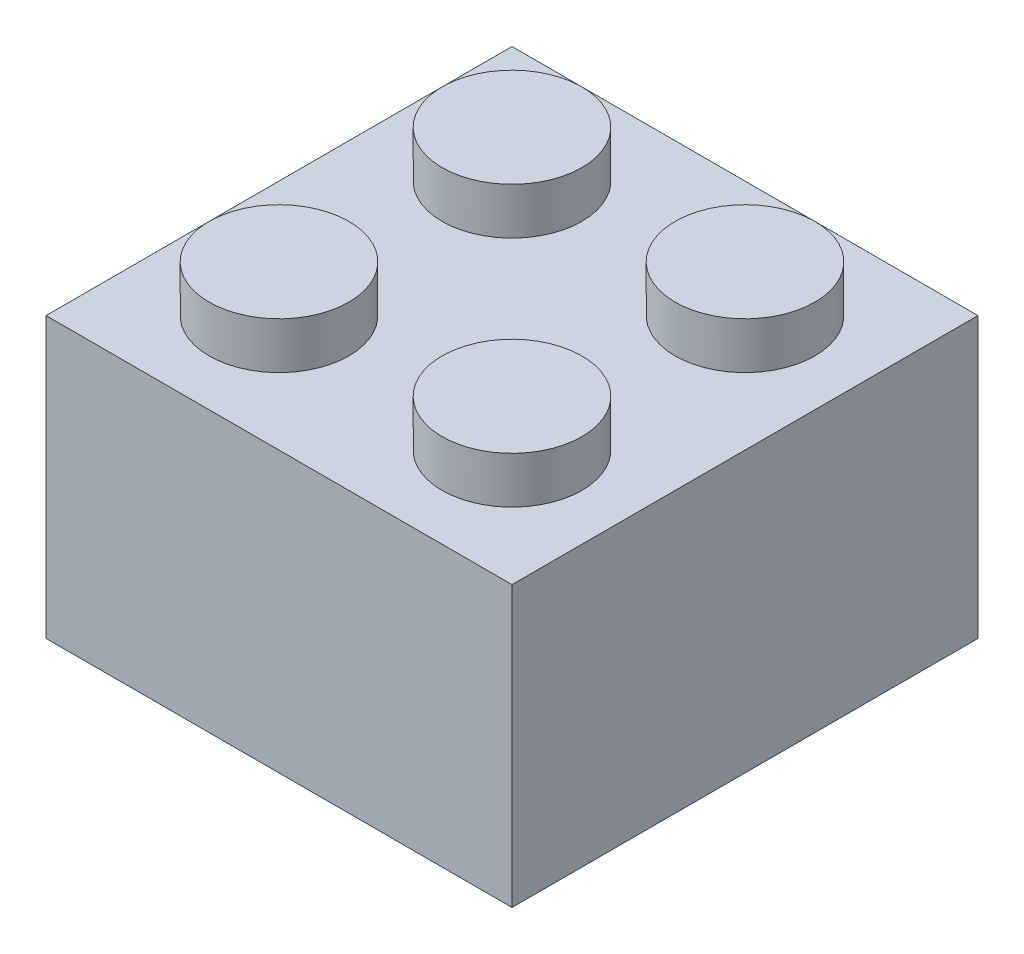
ISO-10303-21;
HEADER;
FILE_DESCRIPTION(('STEP AP214'),'2;1');
FILE_NAME('part.step','',(''),(''),'','','');
FILE_SCHEMA(('AUTOMOTIVE_DESIGN { 1 0 10303 214 1 1 1 1 }'));
ENDSEC;
DATA;
#1=APPLICATION_CONTEXT('core data for automotive mechanical design processes');
#2=APPLICATION_PROTOCOL_DEFINITION('international standard','automotive_design',2000,#1);
#3=PRODUCT_CONTEXT('',#1,'mechanical');
#4=PRODUCT('Part','Part','',(#3));
#5=PRODUCT_RELATED_PRODUCT_CATEGORY('part','',(#4));
#6=PRODUCT_DEFINITION_FORMATION('','',#4);
#7=PRODUCT_DEFINITION_CONTEXT('part definition',#1,'design');
#8=PRODUCT_DEFINITION('design','',#6,#7);
#9=PRODUCT_DEFINITION_SHAPE('','',#8);
#10=(LENGTH_UNIT() NAMED_UNIT(*) SI_UNIT(.MILLI.,.METRE.));
#11=(NAMED_UNIT(*) PLANE_ANGLE_UNIT() SI_UNIT($,.RADIAN.));
#12=(NAMED_UNIT(*) SI_UNIT($,.STERADIAN.) SOLID_ANGLE_UNIT());
#13=UNCERTAINTY_MEASURE_WITH_UNIT(LENGTH_MEASURE(1.E-05),#10,'distance_accuracy_value','');
#14=(GEOMETRIC_REPRESENTATION_CONTEXT(3) GLOBAL_UNCERTAINTY_ASSIGNED_CONTEXT((#13)) GLOBAL_UNIT_ASSIGNED_CONTEXT((#10,
#11,#12)) REPRESENTATION_CONTEXT('',''));
#15=CARTESIAN_POINT('',(0.,0.,0.));
#16=DIRECTION('',(0.,0.,1.));
#17=DIRECTION('',(1.,0.,0.));
#18=AXIS2_PLACEMENT_3D('',#15,#16,#17);
#19=CARTESIAN_POINT('',(12.,4.8,4.));
#20=DIRECTION('',(-1.,0.,0.));
#21=DIRECTION('',(0.,0.,1.));
#22=AXIS2_PLACEMENT_3D('',#19,#20,#21);
#23=PLANE('',#22);
#24=DIRECTION('',(0.,0.,-1.));
#25=VECTOR('',#24,1.);
#26=CARTESIAN_POINT('',(12.,0.,4.));
#27=LINE('',#26,#25);
#28=CARTESIAN_POINT('',(12.,0.,12.));
#29=VERTEX_POINT('',#28);
#30=CARTESIAN_POINT('',(12.,0.,-4.));
#31=VERTEX_POINT('',#30);
#32=EDGE_CURVE('E120',#29,#31,#27,.T.);
#33=ORIENTED_EDGE('',*,*,#32,.T.);
#34=DIRECTION('',(0.,-1.,0.));
#35=VECTOR('',#34,1.);
#36=CARTESIAN_POINT('',(12.,4.8,-4.));
#37=LINE('',#36,#35);
#38=CARTESIAN_POINT('',(12.,9.6,-4.));
#39=VERTEX_POINT('',#38);
#40=EDGE_CURVE('E21',#39,#31,#37,.T.);
#41=ORIENTED_EDGE('',*,*,#40,.F.);
#42=DIRECTION('',(0.,0.,-1.));
#43=VECTOR('',#42,1.);
#44=CARTESIAN_POINT('',(12.,9.6,4.));
#45=LINE('',#44,#43);
#46=CARTESIAN_POINT('',(12.,9.6,12.));
#47=VERTEX_POINT('',#46);
#48=EDGE_CURVE('E11',#47,#39,#45,.T.);
#49=ORIENTED_EDGE('',*,*,#48,.F.);
#50=DIRECTION('',(0.,1.,0.));
#51=VECTOR('',#50,1.);
#52=CARTESIAN_POINT('',(12.,4.8,12.));
#53=LINE('',#52,#51);
#54=EDGE_CURVE('E122',#29,#47,#53,.T.);
#55=ORIENTED_EDGE('',*,*,#54,.F.);
#56=EDGE_LOOP('',(#33,#41,#49,#55));
#57=FACE_BOUND('',#56,.T.);
#58=ADVANCED_FACE('F17',(#57),#23,.F.);
#59=CARTESIAN_POINT('',(4.,9.6,4.));
#60=DIRECTION('',(0.,-1.,0.));
#61=DIRECTION('',(0.,0.,-1.));
#62=AXIS2_PLACEMENT_3D('',#59,#60,#61);
#63=PLANE('',#62);
#64=ORIENTED_EDGE('',*,*,#48,.T.);
#65=DIRECTION('',(1.,0.,0.));
#66=VECTOR('',#65,1.);
#67=CARTESIAN_POINT('',(4.,9.6,-4.));
#68=LINE('',#67,#66);
#69=CARTESIAN_POINT('',(-4.,9.6,-4.));
#70=VERTEX_POINT('',#69);
#71=EDGE_CURVE('E129',#70,#39,#68,.T.);
#72=ORIENTED_EDGE('',*,*,#71,.F.);
#73=DIRECTION('',(0.,0.,-1.));
#74=VECTOR('',#73,1.);
#75=CARTESIAN_POINT('',(-4.,9.6,4.));
#76=LINE('',#75,#74);
#77=CARTESIAN_POINT('',(-4.,9.6,12.));
#78=VERTEX_POINT('',#77);
#79=EDGE_CURVE('E27',#78,#70,#76,.T.);
#80=ORIENTED_EDGE('',*,*,#79,.F.);
#81=DIRECTION('',(-1.,0.,0.));
#82=VECTOR('',#81,1.);
#83=CARTESIAN_POINT('',(4.,9.6,12.));
#84=LINE('',#83,#82);
#85=EDGE_CURVE('E145',#47,#78,#84,.T.);
#86=ORIENTED_EDGE('',*,*,#85,.F.);
#87=EDGE_LOOP('',(#64,#72,#80,#86));
#88=FACE_BOUND('',#87,.T.);
#89=CARTESIAN_POINT('',(0.,9.6,0.));
#90=DIRECTION('',(0.,-1.,0.));
#91=DIRECTION('',(1.,0.,0.));
#92=AXIS2_PLACEMENT_3D('',#89,#90,#91);
#93=CIRCLE('',#92,2.4);
#94=CARTESIAN_POINT('',(-2.4,9.6,0.));
#95=VERTEX_POINT('',#94);
#96=EDGE_CURVE('E103',#95,#95,#93,.T.);
#97=ORIENTED_EDGE('',*,*,#96,.T.);
#98=EDGE_LOOP('',(#97));
#99=FACE_BOUND('',#98,.T.);
#100=CARTESIAN_POINT('',(0.,9.6,8.));
#101=DIRECTION('',(0.,-1.,0.));
#102=DIRECTION('',(1.,0.,0.));
#103=AXIS2_PLACEMENT_3D('',#100,#101,#102);
#104=CIRCLE('',#103,2.4);
#105=CARTESIAN_POINT('',(-2.4,9.6,8.));
#106=VERTEX_POINT('',#105);
#107=EDGE_CURVE('E104',#106,#106,#104,.T.);
#108=ORIENTED_EDGE('',*,*,#107,.T.);
#109=EDGE_LOOP('',(#108));
#110=FACE_BOUND('',#109,.T.);
#111=CARTESIAN_POINT('',(8.,9.6,0.));
#112=DIRECTION('',(0.,-1.,0.));
#113=DIRECTION('',(1.,0.,0.));
#114=AXIS2_PLACEMENT_3D('',#111,#112,#113);
#115=CIRCLE('',#114,2.4);
#116=CARTESIAN_POINT('',(5.6,9.6,0.));
#117=VERTEX_POINT('',#116);
#118=EDGE_CURVE('E107',#117,#117,#115,.T.);
#119=ORIENTED_EDGE('',*,*,#118,.T.);
#120=EDGE_LOOP('',(#119));
#121=FACE_BOUND('',#120,.T.);
#122=CARTESIAN_POINT('',(8.,9.6,8.));
#123=DIRECTION('',(0.,-1.,0.));
#124=DIRECTION('',(1.,0.,0.));
#125=AXIS2_PLACEMENT_3D('',#122,#123,#124);
#126=CIRCLE('',#125,2.4);
#127=CARTESIAN_POINT('',(5.6,9.6,8.));
#128=VERTEX_POINT('',#127);
#129=EDGE_CURVE('E108',#128,#128,#126,.T.);
#130=ORIENTED_EDGE('',*,*,#129,.T.);
#131=EDGE_LOOP('',(#130));
#132=FACE_BOUND('',#131,.T.);
#133=ADVANCED_FACE('F206',(#88,#99,#110,#121,#132),#63,.F.);
#134=CARTESIAN_POINT('',(-4.,4.8,4.));
#135=DIRECTION('',(1.,0.,0.));
#136=DIRECTION('',(0.,0.,-1.));
#137=AXIS2_PLACEMENT_3D('',#134,#135,#136);
#138=PLANE('',#137);
#139=ORIENTED_EDGE('',*,*,#79,.T.);
#140=DIRECTION('',(0.,1.,0.));
#141=VECTOR('',#140,1.);
#142=CARTESIAN_POINT('',(-4.,4.8,-4.));
#143=LINE('',#142,#141);
#144=CARTESIAN_POINT('',(-4.,0.,-4.));
#145=VERTEX_POINT('',#144);
#146=EDGE_CURVE('E97',#145,#70,#143,.T.);
#147=ORIENTED_EDGE('',*,*,#146,.F.);
#148=DIRECTION('',(0.,0.,-1.));
#149=VECTOR('',#148,1.);
#150=CARTESIAN_POINT('',(-4.,0.,4.));
#151=LINE('',#150,#149);
#152=CARTESIAN_POINT('',(-4.,0.,12.));
#153=VERTEX_POINT('',#152);
#154=EDGE_CURVE('E127',#153,#145,#151,.T.);
#155=ORIENTED_EDGE('',*,*,#154,.F.);
#156=DIRECTION('',(0.,-1.,0.));
#157=VECTOR('',#156,1.);
#158=CARTESIAN_POINT('',(-4.,4.8,12.));
#159=LINE('',#158,#157);
#160=EDGE_CURVE('E112',#78,#153,#159,.T.);
#161=ORIENTED_EDGE('',*,*,#160,.F.);
#162=EDGE_LOOP('',(#139,#147,#155,#161));
#163=FACE_BOUND('',#162,.T.);
#164=ADVANCED_FACE('F161',(#163),#138,.F.);
#165=CARTESIAN_POINT('',(4.,0.,4.));
#166=DIRECTION('',(0.,1.,0.));
#167=DIRECTION('',(0.,0.,1.));
#168=AXIS2_PLACEMENT_3D('',#165,#166,#167);
#169=PLANE('',#168);
#170=ORIENTED_EDGE('',*,*,#154,.T.);
#171=DIRECTION('',(-1.,0.,0.));
#172=VECTOR('',#171,1.);
#173=CARTESIAN_POINT('',(4.,0.,-4.));
#174=LINE('',#173,#172);
#175=EDGE_CURVE('E116',#31,#145,#174,.T.);
#176=ORIENTED_EDGE('',*,*,#175,.F.);
#177=ORIENTED_EDGE('',*,*,#32,.F.);
#178=DIRECTION('',(1.,0.,0.));
#179=VECTOR('',#178,1.);
#180=CARTESIAN_POINT('',(4.,0.,12.));
#181=LINE('',#180,#179);
#182=EDGE_CURVE('E109',#153,#29,#181,.T.);
#183=ORIENTED_EDGE('',*,*,#182,.F.);
#184=EDGE_LOOP('',(#170,#176,#177,#183));
#185=FACE_BOUND('',#184,.T.);
#186=CARTESIAN_POINT('',(0.,0.,0.));
#187=DIRECTION('',(0.,1.,0.));
#188=DIRECTION('',(1.,0.,0.));
#189=AXIS2_PLACEMENT_3D('',#186,#187,#188);
#190=CIRCLE('',#189,2.4);
#191=CARTESIAN_POINT('',(-2.4,0.,0.));
#192=VERTEX_POINT('',#191);
#193=EDGE_CURVE('E123',#192,#192,#190,.T.);
#194=ORIENTED_EDGE('',*,*,#193,.T.);
#195=EDGE_LOOP('',(#194));
#196=FACE_BOUND('',#195,.T.);
#197=CARTESIAN_POINT('',(0.,0.,8.));
#198=DIRECTION('',(0.,1.,0.));
#199=DIRECTION('',(1.,0.,0.));
#200=AXIS2_PLACEMENT_3D('',#197,#198,#199);
#201=CIRCLE('',#200,2.4);
#202=CARTESIAN_POINT('',(-2.4,0.,8.));
#203=VERTEX_POINT('',#202);
#204=EDGE_CURVE('E93',#203,#203,#201,.T.);
#205=ORIENTED_EDGE('',*,*,#204,.T.);
#206=EDGE_LOOP('',(#205));
#207=FACE_BOUND('',#206,.T.);
#208=CARTESIAN_POINT('',(8.,0.,0.));
#209=DIRECTION('',(0.,1.,0.));
#210=DIRECTION('',(1.,0.,0.));
#211=AXIS2_PLACEMENT_3D('',#208,#209,#210);
#212=CIRCLE('',#211,2.4);
#213=CARTESIAN_POINT('',(5.6,0.,0.));
#214=VERTEX_POINT('',#213);
#215=EDGE_CURVE('E87',#214,#214,#212,.T.);
#216=ORIENTED_EDGE('',*,*,#215,.T.);
#217=EDGE_LOOP('',(#216));
#218=FACE_BOUND('',#217,.T.);
#219=CARTESIAN_POINT('',(8.,0.,8.));
#220=DIRECTION('',(0.,1.,0.));
#221=DIRECTION('',(1.,0.,0.));
#222=AXIS2_PLACEMENT_3D('',#219,#220,#221);
#223=CIRCLE('',#222,2.4);
#224=CARTESIAN_POINT('',(5.6,0.,8.));
#225=VERTEX_POINT('',#224);
#226=EDGE_CURVE('E94',#225,#225,#223,.T.);
#227=ORIENTED_EDGE('',*,*,#226,.T.);
#228=EDGE_LOOP('',(#227));
#229=FACE_BOUND('',#228,.T.);
#230=CARTESIAN_POINT('',(4.,0.,4.));
#231=DIRECTION('',(0.,1.,0.));
#232=DIRECTION('',(1.,0.,0.));
#233=AXIS2_PLACEMENT_3D('',#230,#231,#232);
#234=CIRCLE('',#233,2.4);
#235=CARTESIAN_POINT('',(1.6,0.,4.));
#236=VERTEX_POINT('',#235);
#237=EDGE_CURVE('E137',#236,#236,#234,.T.);
#238=ORIENTED_EDGE('',*,*,#237,.T.);
#239=EDGE_LOOP('',(#238));
#240=FACE_BOUND('',#239,.T.);
#241=ADVANCED_FACE('F88',(#185,#196,#207,#218,#229,#240),#169,.F.);
#242=CARTESIAN_POINT('',(4.,4.8,-4.));
#243=DIRECTION('',(0.,0.,1.));
#244=DIRECTION('',(1.,0.,0.));
#245=AXIS2_PLACEMENT_3D('',#242,#243,#244);
#246=PLANE('',#245);
#247=ORIENTED_EDGE('',*,*,#40,.T.);
#248=ORIENTED_EDGE('',*,*,#175,.T.);
#249=ORIENTED_EDGE('',*,*,#146,.T.);
#250=ORIENTED_EDGE('',*,*,#71,.T.);
#251=EDGE_LOOP('',(#247,#248,#249,#250));
#252=FACE_BOUND('',#251,.T.);
#253=ADVANCED_FACE('F239',(#252),#246,.F.);
#254=CARTESIAN_POINT('',(4.,4.8,12.));
#255=DIRECTION('',(0.,0.,1.));
#256=DIRECTION('',(1.,0.,0.));
#257=AXIS2_PLACEMENT_3D('',#254,#255,#256);
#258=PLANE('',#257);
#259=ORIENTED_EDGE('',*,*,#54,.T.);
#260=ORIENTED_EDGE('',*,*,#85,.T.);
#261=ORIENTED_EDGE('',*,*,#160,.T.);
#262=ORIENTED_EDGE('',*,*,#182,.T.);
#263=EDGE_LOOP('',(#259,#260,#261,#262));
#264=FACE_BOUND('',#263,.T.);
#265=ADVANCED_FACE('F19',(#264),#258,.T.);
#266=CARTESIAN_POINT('',(0.,11.2,0.));
#267=DIRECTION('',(0.,1.,0.));
#268=DIRECTION('',(1.,0.,0.));
#269=AXIS2_PLACEMENT_3D('',#266,#267,#268);
#270=PLANE('',#269);
#271=CARTESIAN_POINT('',(0.,11.2,0.));
#272=DIRECTION('',(0.,1.,0.));
#273=DIRECTION('',(1.,0.,0.));
#274=AXIS2_PLACEMENT_3D('',#271,#272,#273);
#275=CIRCLE('',#274,2.4);
#276=CARTESIAN_POINT('',(2.4,11.2,0.));
#277=VERTEX_POINT('',#276);
#278=EDGE_CURVE('E100',#277,#277,#275,.T.);
#279=ORIENTED_EDGE('',*,*,#278,.T.);
#280=EDGE_LOOP('',(#279));
#281=FACE_BOUND('',#280,.T.);
#282=ADVANCED_FACE('F246',(#281),#270,.T.);
#283=CARTESIAN_POINT('',(0.,10.15,0.));
#284=DIRECTION('',(0.,-1.,0.));
#285=DIRECTION('',(1.,0.,0.));
#286=AXIS2_PLACEMENT_3D('',#283,#284,#285);
#287=CYLINDRICAL_SURFACE('',#286,2.4);
#288=ORIENTED_EDGE('',*,*,#96,.F.);
#289=EDGE_LOOP('',(#288));
#290=FACE_BOUND('',#289,.T.);
#291=ORIENTED_EDGE('',*,*,#278,.F.);
#292=EDGE_LOOP('',(#291));
#293=FACE_BOUND('',#292,.T.);
#294=ADVANCED_FACE('F248',(#290,#293),#287,.T.);
#295=CARTESIAN_POINT('',(0.,11.2,8.));
#296=DIRECTION('',(0.,1.,0.));
#297=DIRECTION('',(1.,0.,0.));
#298=AXIS2_PLACEMENT_3D('',#295,#296,#297);
#299=PLANE('',#298);
#300=CARTESIAN_POINT('',(0.,11.2,8.));
#301=DIRECTION('',(0.,1.,0.));
#302=DIRECTION('',(1.,0.,0.));
#303=AXIS2_PLACEMENT_3D('',#300,#301,#302);
#304=CIRCLE('',#303,2.4);
#305=CARTESIAN_POINT('',(2.4,11.2,8.));
#306=VERTEX_POINT('',#305);
#307=EDGE_CURVE('E140',#306,#306,#304,.T.);
#308=ORIENTED_EDGE('',*,*,#307,.T.);
#309=EDGE_LOOP('',(#308));
#310=FACE_BOUND('',#309,.T.);
#311=ADVANCED_FACE('F254',(#310),#299,.T.);
#312=CARTESIAN_POINT('',(0.,10.15,8.));
#313=DIRECTION('',(0.,-1.,0.));
#314=DIRECTION('',(1.,0.,0.));
#315=AXIS2_PLACEMENT_3D('',#312,#313,#314);
#316=CYLINDRICAL_SURFACE('',#315,2.4);
#317=ORIENTED_EDGE('',*,*,#107,.F.);
#318=EDGE_LOOP('',(#317));
#319=FACE_BOUND('',#318,.T.);
#320=ORIENTED_EDGE('',*,*,#307,.F.);
#321=EDGE_LOOP('',(#320));
#322=FACE_BOUND('',#321,.T.);
#323=ADVANCED_FACE('F242',(#319,#322),#316,.T.);
#324=CARTESIAN_POINT('',(8.,11.2,0.));
#325=DIRECTION('',(0.,1.,0.));
#326=DIRECTION('',(1.,0.,0.));
#327=AXIS2_PLACEMENT_3D('',#324,#325,#326);
#328=PLANE('',#327);
#329=CARTESIAN_POINT('',(8.,11.2,0.));
#330=DIRECTION('',(0.,1.,0.));
#331=DIRECTION('',(1.,0.,0.));
#332=AXIS2_PLACEMENT_3D('',#329,#330,#331);
#333=CIRCLE('',#332,2.4);
#334=CARTESIAN_POINT('',(10.4,11.2,0.));
#335=VERTEX_POINT('',#334);
#336=EDGE_CURVE('E105',#335,#335,#333,.T.);
#337=ORIENTED_EDGE('',*,*,#336,.T.);
#338=EDGE_LOOP('',(#337));
#339=FACE_BOUND('',#338,.T.);
#340=ADVANCED_FACE('F225',(#339),#328,.T.);
#341=CARTESIAN_POINT('',(8.,10.15,0.));
#342=DIRECTION('',(0.,-1.,0.));
#343=DIRECTION('',(1.,0.,0.));
#344=AXIS2_PLACEMENT_3D('',#341,#342,#343);
#345=CYLINDRICAL_SURFACE('',#344,2.4);
#346=ORIENTED_EDGE('',*,*,#118,.F.);
#347=EDGE_LOOP('',(#346));
#348=FACE_BOUND('',#347,.T.);
#349=ORIENTED_EDGE('',*,*,#336,.F.);
#350=EDGE_LOOP('',(#349));
#351=FACE_BOUND('',#350,.T.);
#352=ADVANCED_FACE('F221',(#348,#351),#345,.T.);
#353=CARTESIAN_POINT('',(8.,11.2,8.));
#354=DIRECTION('',(0.,1.,0.));
#355=DIRECTION('',(1.,0.,0.));
#356=AXIS2_PLACEMENT_3D('',#353,#354,#355);
#357=PLANE('',#356);
#358=CARTESIAN_POINT('',(8.,11.2,8.));
#359=DIRECTION('',(0.,1.,0.));
#360=DIRECTION('',(1.,0.,0.));
#361=AXIS2_PLACEMENT_3D('',#358,#359,#360);
#362=CIRCLE('',#361,2.4);
#363=CARTESIAN_POINT('',(10.4,11.2,8.));
#364=VERTEX_POINT('',#363);
#365=EDGE_CURVE('E130',#364,#364,#362,.T.);
#366=ORIENTED_EDGE('',*,*,#365,.T.);
#367=EDGE_LOOP('',(#366));
#368=FACE_BOUND('',#367,.T.);
#369=ADVANCED_FACE('F224',(#368),#357,.T.);
#370=CARTESIAN_POINT('',(8.,10.15,8.));
#371=DIRECTION('',(0.,-1.,0.));
#372=DIRECTION('',(1.,0.,0.));
#373=AXIS2_PLACEMENT_3D('',#370,#371,#372);
#374=CYLINDRICAL_SURFACE('',#373,2.4);
#375=ORIENTED_EDGE('',*,*,#129,.F.);
#376=EDGE_LOOP('',(#375));
#377=FACE_BOUND('',#376,.T.);
#378=ORIENTED_EDGE('',*,*,#365,.F.);
#379=EDGE_LOOP('',(#378));
#380=FACE_BOUND('',#379,.T.);
#381=ADVANCED_FACE('F227',(#377,#380),#374,.T.);
#382=CARTESIAN_POINT('',(0.,1.6,0.));
#383=DIRECTION('',(0.,1.,0.));
#384=DIRECTION('',(1.,0.,0.));
#385=AXIS2_PLACEMENT_3D('',#382,#383,#384);
#386=PLANE('',#385);
#387=CARTESIAN_POINT('',(0.,1.6,0.));
#388=DIRECTION('',(0.,1.,0.));
#389=DIRECTION('',(1.,0.,0.));
#390=AXIS2_PLACEMENT_3D('',#387,#388,#389);
#391=CIRCLE('',#390,2.4);
#392=CARTESIAN_POINT('',(2.4,1.6,0.));
#393=VERTEX_POINT('',#392);
#394=EDGE_CURVE('E126',#393,#393,#391,.T.);
#395=ORIENTED_EDGE('',*,*,#394,.F.);
#396=EDGE_LOOP('',(#395));
#397=FACE_BOUND('',#396,.T.);
#398=ADVANCED_FACE('F230',(#397),#386,.F.);
#399=CARTESIAN_POINT('',(0.,0.55,0.));
#400=DIRECTION('',(0.,-1.,0.));
#401=DIRECTION('',(1.,0.,0.));
#402=AXIS2_PLACEMENT_3D('',#399,#400,#401);
#403=CYLINDRICAL_SURFACE('',#402,2.4);
#404=ORIENTED_EDGE('',*,*,#394,.T.);
#405=EDGE_LOOP('',(#404));
#406=FACE_BOUND('',#405,.T.);
#407=ORIENTED_EDGE('',*,*,#193,.F.);
#408=EDGE_LOOP('',(#407));
#409=FACE_BOUND('',#408,.T.);
#410=ADVANCED_FACE('F200',(#406,#409),#403,.F.);
#411=CARTESIAN_POINT('',(0.,1.6,8.));
#412=DIRECTION('',(0.,1.,0.));
#413=DIRECTION('',(1.,0.,0.));
#414=AXIS2_PLACEMENT_3D('',#411,#412,#413);
#415=PLANE('',#414);
#416=CARTESIAN_POINT('',(0.,1.6,8.));
#417=DIRECTION('',(0.,1.,0.));
#418=DIRECTION('',(1.,0.,0.));
#419=AXIS2_PLACEMENT_3D('',#416,#417,#418);
#420=CIRCLE('',#419,2.4);
#421=CARTESIAN_POINT('',(2.4,1.6,8.));
#422=VERTEX_POINT('',#421);
#423=EDGE_CURVE('E115',#422,#422,#420,.T.);
#424=ORIENTED_EDGE('',*,*,#423,.F.);
#425=EDGE_LOOP('',(#424));
#426=FACE_BOUND('',#425,.T.);
#427=ADVANCED_FACE('F190',(#426),#415,.F.);
#428=CARTESIAN_POINT('',(0.,0.55,8.));
#429=DIRECTION('',(0.,-1.,0.));
#430=DIRECTION('',(1.,0.,0.));
#431=AXIS2_PLACEMENT_3D('',#428,#429,#430);
#432=CYLINDRICAL_SURFACE('',#431,2.4);
#433=ORIENTED_EDGE('',*,*,#423,.T.);
#434=EDGE_LOOP('',(#433));
#435=FACE_BOUND('',#434,.T.);
#436=ORIENTED_EDGE('',*,*,#204,.F.);
#437=EDGE_LOOP('',(#436));
#438=FACE_BOUND('',#437,.T.);
#439=ADVANCED_FACE('F187',(#435,#438),#432,.F.);
#440=CARTESIAN_POINT('',(8.,1.6,0.));
#441=DIRECTION('',(0.,1.,0.));
#442=DIRECTION('',(1.,0.,0.));
#443=AXIS2_PLACEMENT_3D('',#440,#441,#442);
#444=PLANE('',#443);
#445=CARTESIAN_POINT('',(8.,1.6,0.));
#446=DIRECTION('',(0.,1.,0.));
#447=DIRECTION('',(1.,0.,0.));
#448=AXIS2_PLACEMENT_3D('',#445,#446,#447);
#449=CIRCLE('',#448,2.4);
#450=CARTESIAN_POINT('',(10.4,1.6,0.));
#451=VERTEX_POINT('',#450);
#452=EDGE_CURVE('E91',#451,#451,#449,.T.);
#453=ORIENTED_EDGE('',*,*,#452,.F.);
#454=EDGE_LOOP('',(#453));
#455=FACE_BOUND('',#454,.T.);
#456=ADVANCED_FACE('F189',(#455),#444,.F.);
#457=CARTESIAN_POINT('',(8.,0.55,0.));
#458=DIRECTION('',(0.,-1.,0.));
#459=DIRECTION('',(1.,0.,0.));
#460=AXIS2_PLACEMENT_3D('',#457,#458,#459);
#461=CYLINDRICAL_SURFACE('',#460,2.4);
#462=ORIENTED_EDGE('',*,*,#452,.T.);
#463=EDGE_LOOP('',(#462));
#464=FACE_BOUND('',#463,.T.);
#465=ORIENTED_EDGE('',*,*,#215,.F.);
#466=EDGE_LOOP('',(#465));
#467=FACE_BOUND('',#466,.T.);
#468=ADVANCED_FACE('F198',(#464,#467),#461,.F.);
#469=CARTESIAN_POINT('',(8.,1.6,8.));
#470=DIRECTION('',(0.,1.,0.));
#471=DIRECTION('',(1.,0.,0.));
#472=AXIS2_PLACEMENT_3D('',#469,#470,#471);
#473=PLANE('',#472);
#474=CARTESIAN_POINT('',(8.,1.6,8.));
#475=DIRECTION('',(0.,1.,0.));
#476=DIRECTION('',(1.,0.,0.));
#477=AXIS2_PLACEMENT_3D('',#474,#475,#476);
#478=CIRCLE('',#477,2.4);
#479=CARTESIAN_POINT('',(10.4,1.6,8.));
#480=VERTEX_POINT('',#479);
#481=EDGE_CURVE('E83',#480,#480,#478,.T.);
#482=ORIENTED_EDGE('',*,*,#481,.F.);
#483=EDGE_LOOP('',(#482));
#484=FACE_BOUND('',#483,.T.);
#485=ADVANCED_FACE('F217',(#484),#473,.F.);
#486=CARTESIAN_POINT('',(8.,0.55,8.));
#487=DIRECTION('',(0.,-1.,0.));
#488=DIRECTION('',(1.,0.,0.));
#489=AXIS2_PLACEMENT_3D('',#486,#487,#488);
#490=CYLINDRICAL_SURFACE('',#489,2.4);
#491=ORIENTED_EDGE('',*,*,#481,.T.);
#492=EDGE_LOOP('',(#491));
#493=FACE_BOUND('',#492,.T.);
#494=ORIENTED_EDGE('',*,*,#226,.F.);
#495=EDGE_LOOP('',(#494));
#496=FACE_BOUND('',#495,.T.);
#497=ADVANCED_FACE('F215',(#493,#496),#490,.F.);
#498=CARTESIAN_POINT('',(4.,1.6,4.));
#499=DIRECTION('',(0.,1.,0.));
#500=DIRECTION('',(1.,0.,0.));
#501=AXIS2_PLACEMENT_3D('',#498,#499,#500);
#502=PLANE('',#501);
#503=CARTESIAN_POINT('',(4.,1.6,4.));
#504=DIRECTION('',(0.,1.,0.));
#505=DIRECTION('',(1.,0.,0.));
#506=AXIS2_PLACEMENT_3D('',#503,#504,#505);
#507=CIRCLE('',#506,2.4);
#508=CARTESIAN_POINT('',(6.4,1.6,4.));
#509=VERTEX_POINT('',#508);
#510=EDGE_CURVE('E135',#509,#509,#507,.T.);
#511=ORIENTED_EDGE('',*,*,#510,.F.);
#512=EDGE_LOOP('',(#511));
#513=FACE_BOUND('',#512,.T.);
#514=ADVANCED_FACE('F232',(#513),#502,.F.);
#515=CARTESIAN_POINT('',(4.,0.55,4.));
#516=DIRECTION('',(0.,-1.,0.));
#517=DIRECTION('',(1.,0.,0.));
#518=AXIS2_PLACEMENT_3D('',#515,#516,#517);
#519=CYLINDRICAL_SURFACE('',#518,2.4);
#520=ORIENTED_EDGE('',*,*,#510,.T.);
#521=EDGE_LOOP('',(#520));
#522=FACE_BOUND('',#521,.T.);
#523=ORIENTED_EDGE('',*,*,#237,.F.);
#524=EDGE_LOOP('',(#523));
#525=FACE_BOUND('',#524,.T.);
#526=ADVANCED_FACE('F235',(#522,#525),#519,.F.);
#527=CLOSED_SHELL('',(#58,#133,#164,#241,#253,#265,#282,#294,#311,#323,#340,#352,#369,#381,#398,
#410,#427,#439,#456,#468,#485,#497,#514,#526));
#528=MANIFOLD_SOLID_BREP('B1',#527);
#529=ADVANCED_BREP_SHAPE_REPRESENTATION('',(#18,#528),#14);
#530=SHAPE_DEFINITION_REPRESENTATION(#9,#529);
ENDSEC;
END-ISO-10303-21;
